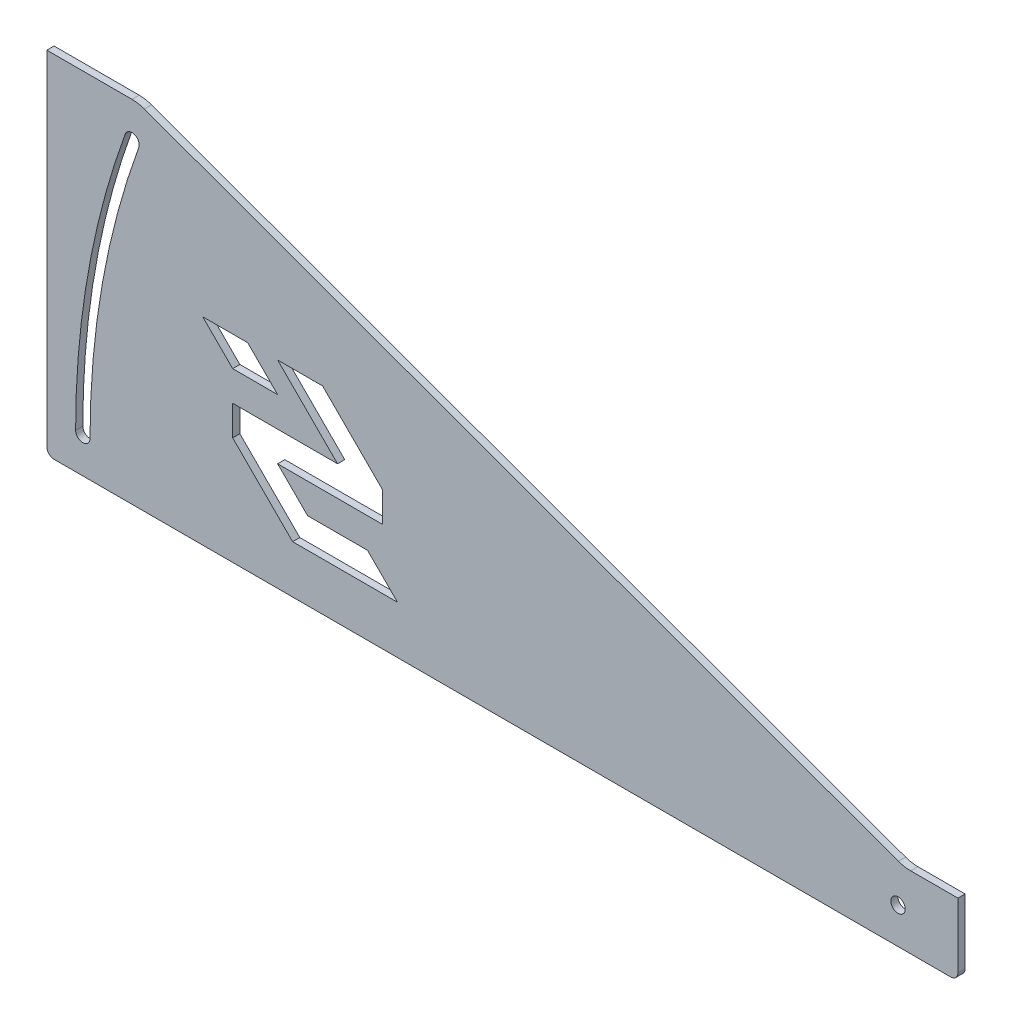
ISO-10303-21;
HEADER;
FILE_DESCRIPTION(('STEP AP214'),'2;1');
FILE_NAME('part.step','',(''),(''),'','','');
FILE_SCHEMA(('AUTOMOTIVE_DESIGN { 1 0 10303 214 1 1 1 1 }'));
ENDSEC;
DATA;
#1=APPLICATION_CONTEXT('core data for automotive mechanical design processes');
#2=APPLICATION_PROTOCOL_DEFINITION('international standard','automotive_design',2000,#1);
#3=PRODUCT_CONTEXT('',#1,'mechanical');
#4=PRODUCT('Part','Part','',(#3));
#5=PRODUCT_RELATED_PRODUCT_CATEGORY('part','',(#4));
#6=PRODUCT_DEFINITION_FORMATION('','',#4);
#7=PRODUCT_DEFINITION_CONTEXT('part definition',#1,'design');
#8=PRODUCT_DEFINITION('design','',#6,#7);
#9=PRODUCT_DEFINITION_SHAPE('','',#8);
#10=(LENGTH_UNIT() NAMED_UNIT(*) SI_UNIT(.MILLI.,.METRE.));
#11=(NAMED_UNIT(*) PLANE_ANGLE_UNIT() SI_UNIT($,.RADIAN.));
#12=(NAMED_UNIT(*) SI_UNIT($,.STERADIAN.) SOLID_ANGLE_UNIT());
#13=UNCERTAINTY_MEASURE_WITH_UNIT(LENGTH_MEASURE(1.E-05),#10,'distance_accuracy_value','');
#14=(GEOMETRIC_REPRESENTATION_CONTEXT(3) GLOBAL_UNCERTAINTY_ASSIGNED_CONTEXT((#13)) GLOBAL_UNIT_ASSIGNED_CONTEXT((#10,
#11,#12)) REPRESENTATION_CONTEXT('',''));
#15=CARTESIAN_POINT('',(0.,0.,0.));
#16=DIRECTION('',(0.,0.,1.));
#17=DIRECTION('',(1.,0.,0.));
#18=AXIS2_PLACEMENT_3D('',#15,#16,#17);
#19=CARTESIAN_POINT('',(0.,0.,3.));
#20=DIRECTION('',(0.,0.,1.));
#21=DIRECTION('',(1.,0.,0.));
#22=AXIS2_PLACEMENT_3D('',#19,#20,#21);
#23=PLANE('',#22);
#24=DIRECTION('',(-1.,0.,0.));
#25=VECTOR('',#24,1.);
#26=CARTESIAN_POINT('',(0.,-3.14342436536373,3.));
#27=LINE('',#26,#25);
#28=CARTESIAN_POINT('',(-88.75,-3.14342436536373,3.));
#29=VERTEX_POINT('',#28);
#30=CARTESIAN_POINT('',(-107.5,-3.14342436536372,3.));
#31=VERTEX_POINT('',#30);
#32=EDGE_CURVE('E395',#29,#31,#27,.T.);
#33=ORIENTED_EDGE('',*,*,#32,.T.);
#34=DIRECTION('',(-0.707106781186541,0.707106781186554,0.));
#35=VECTOR('',#34,1.);
#36=CARTESIAN_POINT('',(-55.3217121826829,-55.3217121826819,3.));
#37=LINE('',#36,#35);
#38=CARTESIAN_POINT('',(-120.,9.35657563463628,3.));
#39=VERTEX_POINT('',#38);
#40=EDGE_CURVE('E417',#31,#39,#37,.T.);
#41=ORIENTED_EDGE('',*,*,#40,.T.);
#42=DIRECTION('',(-1.,0.,0.));
#43=VECTOR('',#42,1.);
#44=CARTESIAN_POINT('',(0.,9.35657563463628,3.));
#45=LINE('',#44,#43);
#46=CARTESIAN_POINT('',(-101.25,9.35657563463628,3.));
#47=VERTEX_POINT('',#46);
#48=EDGE_CURVE('E293',#47,#39,#45,.T.);
#49=ORIENTED_EDGE('',*,*,#48,.F.);
#50=DIRECTION('',(-0.707106781186546,0.707106781186549,0.));
#51=VECTOR('',#50,1.);
#52=CARTESIAN_POINT('',(-45.946712182682,-45.9467121826818,3.));
#53=LINE('',#52,#51);
#54=EDGE_CURVE('E392',#29,#47,#53,.T.);
#55=ORIENTED_EDGE('',*,*,#54,.F.);
#56=EDGE_LOOP('',(#33,#41,#49,#55));
#57=FACE_BOUND('',#56,.T.);
#58=DIRECTION('',(1.,0.,0.));
#59=VECTOR('',#58,1.);
#60=CARTESIAN_POINT('',(0.,-73.1434243653637,3.));
#61=LINE('',#60,#59);
#62=CARTESIAN_POINT('',(-182.,-73.1434243653637,3.));
#63=VERTEX_POINT('',#62);
#64=CARTESIAN_POINT('',(192.,-73.1434243653636,3.));
#65=VERTEX_POINT('',#64);
#66=EDGE_CURVE('E430',#63,#65,#61,.T.);
#67=ORIENTED_EDGE('',*,*,#66,.T.);
#68=CARTESIAN_POINT('',(192.,-70.1434243653636,3.));
#69=DIRECTION('',(0.,0.,1.));
#70=DIRECTION('',(1.,0.,0.));
#71=AXIS2_PLACEMENT_3D('',#68,#69,#70);
#72=CIRCLE('',#71,3.);
#73=CARTESIAN_POINT('',(195.,-70.1434243653636,3.));
#74=VERTEX_POINT('',#73);
#75=EDGE_CURVE('E97',#65,#74,#72,.T.);
#76=ORIENTED_EDGE('',*,*,#75,.T.);
#77=DIRECTION('',(0.,-1.,0.));
#78=VECTOR('',#77,1.);
#79=CARTESIAN_POINT('',(195.,0.,3.));
#80=LINE('',#79,#78);
#81=CARTESIAN_POINT('',(195.,-43.1434243653637,3.));
#82=VERTEX_POINT('',#81);
#83=EDGE_CURVE('E434',#82,#74,#80,.T.);
#84=ORIENTED_EDGE('',*,*,#83,.F.);
#85=DIRECTION('',(1.,0.,0.));
#86=VECTOR('',#85,1.);
#87=CARTESIAN_POINT('',(0.,-43.1434243653635,3.));
#88=LINE('',#87,#86);
#89=CARTESIAN_POINT('',(175.289809421254,-43.1434243653637,3.));
#90=VERTEX_POINT('',#89);
#91=EDGE_CURVE('E439',#90,#82,#88,.T.);
#92=ORIENTED_EDGE('',*,*,#91,.F.);
#93=CARTESIAN_POINT('',(175.289809421254,-28.1434243653637,3.));
#94=DIRECTION('',(0.,0.,1.));
#95=DIRECTION('',(1.,0.,0.));
#96=AXIS2_PLACEMENT_3D('',#93,#94,#95);
#97=CIRCLE('',#96,15.);
#98=CARTESIAN_POINT('',(170.159507271369,-42.2388136771523,3.));
#99=VERTEX_POINT('',#98);
#100=EDGE_CURVE('E556',#90,#99,#97,.F.);
#101=ORIENTED_EDGE('',*,*,#100,.T.);
#102=DIRECTION('',(-0.939692620785908,0.342020143325669,0.));
#103=VECTOR('',#102,1.);
#104=CARTESIAN_POINT('',(6.32958810137079,17.3904003829649,3.));
#105=LINE('',#104,#103);
#106=CARTESIAN_POINT('',(-144.365188917324,72.2388136771523,3.));
#107=VERTEX_POINT('',#106);
#108=EDGE_CURVE('E442',#99,#107,#105,.T.);
#109=ORIENTED_EDGE('',*,*,#108,.T.);
#110=CARTESIAN_POINT('',(-149.495491067209,58.1434243653637,3.));
#111=DIRECTION('',(0.,0.,1.));
#112=DIRECTION('',(1.,0.,0.));
#113=AXIS2_PLACEMENT_3D('',#110,#111,#112);
#114=CIRCLE('',#113,15.);
#115=CARTESIAN_POINT('',(-149.495491067209,73.1434243653637,3.));
#116=VERTEX_POINT('',#115);
#117=EDGE_CURVE('E550',#107,#116,#114,.T.);
#118=ORIENTED_EDGE('',*,*,#117,.T.);
#119=DIRECTION('',(1.,0.,0.));
#120=VECTOR('',#119,1.);
#121=CARTESIAN_POINT('',(0.,73.1434243653637,3.));
#122=LINE('',#121,#120);
#123=CARTESIAN_POINT('',(-185.,73.1434243653637,3.));
#124=VERTEX_POINT('',#123);
#125=EDGE_CURVE('E446',#124,#116,#122,.T.);
#126=ORIENTED_EDGE('',*,*,#125,.F.);
#127=DIRECTION('',(0.,-1.,0.));
#128=VECTOR('',#127,1.);
#129=CARTESIAN_POINT('',(-185.,0.,3.));
#130=LINE('',#129,#128);
#131=CARTESIAN_POINT('',(-185.,-70.1434243653637,3.));
#132=VERTEX_POINT('',#131);
#133=EDGE_CURVE('E450',#124,#132,#130,.T.);
#134=ORIENTED_EDGE('',*,*,#133,.T.);
#135=CARTESIAN_POINT('',(-182.,-70.1434243653637,3.));
#136=DIRECTION('',(0.,0.,1.));
#137=DIRECTION('',(1.,0.,0.));
#138=AXIS2_PLACEMENT_3D('',#135,#136,#137);
#139=CIRCLE('',#138,3.);
#140=EDGE_CURVE('E576',#132,#63,#139,.T.);
#141=ORIENTED_EDGE('',*,*,#140,.T.);
#142=EDGE_LOOP('',(#67,#76,#84,#92,#101,#109,#118,#126,#134,#141));
#143=FACE_BOUND('',#142,.T.);
#144=CARTESIAN_POINT('',(170.,-58.1434243653637,3.));
#145=DIRECTION('',(0.,0.,1.));
#146=DIRECTION('',(1.,0.,0.));
#147=AXIS2_PLACEMENT_3D('',#144,#145,#146);
#148=CIRCLE('',#147,3.00000000000002);
#149=CARTESIAN_POINT('',(173.,-58.1434243653637,3.));
#150=VERTEX_POINT('',#149);
#151=EDGE_CURVE('E454',#150,#150,#148,.T.);
#152=ORIENTED_EDGE('',*,*,#151,.F.);
#153=EDGE_LOOP('',(#152));
#154=FACE_BOUND('',#153,.T.);
#155=CARTESIAN_POINT('',(-170.,-58.1434243653638,3.));
#156=DIRECTION('',(0.,0.,1.));
#157=DIRECTION('',(1.,0.,0.));
#158=AXIS2_PLACEMENT_3D('',#155,#156,#157);
#159=CIRCLE('',#158,2.99999999999999);
#160=CARTESIAN_POINT('',(-173.,-58.1434243653638,3.));
#161=VERTEX_POINT('',#160);
#162=CARTESIAN_POINT('',(-167.,-58.1434243653638,3.));
#163=VERTEX_POINT('',#162);
#164=EDGE_CURVE('E458',#161,#163,#159,.T.);
#165=ORIENTED_EDGE('',*,*,#164,.F.);
#166=CARTESIAN_POINT('',(170.,-58.1434243653637,3.));
#167=DIRECTION('',(0.,0.,1.));
#168=DIRECTION('',(1.,0.,0.));
#169=AXIS2_PLACEMENT_3D('',#166,#167,#168);
#170=CIRCLE('',#169,343.);
#171=CARTESIAN_POINT('',(-152.314568929567,59.1694847953408,3.));
#172=VERTEX_POINT('',#171);
#173=EDGE_CURVE('E462',#172,#161,#170,.T.);
#174=ORIENTED_EDGE('',*,*,#173,.F.);
#175=CARTESIAN_POINT('',(-149.495491067209,58.1434243653638,3.));
#176=DIRECTION('',(0.,0.,1.));
#177=DIRECTION('',(1.,0.,0.));
#178=AXIS2_PLACEMENT_3D('',#175,#176,#177);
#179=CIRCLE('',#178,2.99999999999997);
#180=CARTESIAN_POINT('',(-146.676413204851,57.1173639353868,3.));
#181=VERTEX_POINT('',#180);
#182=EDGE_CURVE('E466',#181,#172,#179,.T.);
#183=ORIENTED_EDGE('',*,*,#182,.F.);
#184=CARTESIAN_POINT('',(170.,-58.1434243653637,3.));
#185=DIRECTION('',(0.,0.,1.));
#186=DIRECTION('',(1.,0.,0.));
#187=AXIS2_PLACEMENT_3D('',#184,#185,#186);
#188=CIRCLE('',#187,337.);
#189=EDGE_CURVE('E470',#181,#163,#188,.T.);
#190=ORIENTED_EDGE('',*,*,#189,.T.);
#191=EDGE_LOOP('',(#165,#174,#183,#190));
#192=FACE_BOUND('',#191,.T.);
#193=DIRECTION('',(-1.,0.,0.));
#194=VECTOR('',#193,1.);
#195=CARTESIAN_POINT('',(0.,9.35657563463628,3.));
#196=LINE('',#195,#194);
#197=CARTESIAN_POINT('',(-70.,9.35657563463628,3.));
#198=VERTEX_POINT('',#197);
#199=CARTESIAN_POINT('',(-88.7500000000001,9.35657563463628,3.));
#200=VERTEX_POINT('',#199);
#201=EDGE_CURVE('E307',#198,#200,#196,.T.);
#202=ORIENTED_EDGE('',*,*,#201,.F.);
#203=DIRECTION('',(-0.707106781186546,0.707106781186549,0.));
#204=VECTOR('',#203,1.);
#205=CARTESIAN_POINT('',(-30.321712182682,-30.3217121826819,3.));
#206=LINE('',#205,#204);
#207=CARTESIAN_POINT('',(-45.0000000000001,-15.6434243653637,3.));
#208=VERTEX_POINT('',#207);
#209=EDGE_CURVE('E298',#208,#198,#206,.T.);
#210=ORIENTED_EDGE('',*,*,#209,.F.);
#211=DIRECTION('',(0.,-1.,0.));
#212=VECTOR('',#211,1.);
#213=CARTESIAN_POINT('',(-45.0000000000001,0.,3.));
#214=LINE('',#213,#212);
#215=CARTESIAN_POINT('',(-45.0000000000001,-28.1434243653637,3.));
#216=VERTEX_POINT('',#215);
#217=EDGE_CURVE('E284',#208,#216,#214,.T.);
#218=ORIENTED_EDGE('',*,*,#217,.T.);
#219=DIRECTION('',(-1.,0.,0.));
#220=VECTOR('',#219,1.);
#221=CARTESIAN_POINT('',(0.,-28.1434243653637,3.));
#222=LINE('',#221,#220);
#223=CARTESIAN_POINT('',(-88.7500000000002,-28.1434243653637,3.));
#224=VERTEX_POINT('',#223);
#225=EDGE_CURVE('E1036',#216,#224,#222,.T.);
#226=ORIENTED_EDGE('',*,*,#225,.T.);
#227=DIRECTION('',(-0.707106781186546,0.707106781186549,0.));
#228=VECTOR('',#227,1.);
#229=CARTESIAN_POINT('',(-58.4467121826821,-58.4467121826819,3.));
#230=LINE('',#229,#228);
#231=CARTESIAN_POINT('',(-76.2500000000002,-40.6434243653637,3.));
#232=VERTEX_POINT('',#231);
#233=EDGE_CURVE('E1043',#232,#224,#230,.T.);
#234=ORIENTED_EDGE('',*,*,#233,.F.);
#235=DIRECTION('',(-1.,0.,0.));
#236=VECTOR('',#235,1.);
#237=CARTESIAN_POINT('',(0.,-40.6434243653637,3.));
#238=LINE('',#237,#236);
#239=CARTESIAN_POINT('',(-51.2500000000001,-40.6434243653637,3.));
#240=VERTEX_POINT('',#239);
#241=EDGE_CURVE('E1048',#240,#232,#238,.T.);
#242=ORIENTED_EDGE('',*,*,#241,.F.);
#243=DIRECTION('',(0.707106781186546,-0.707106781186549,0.));
#244=VECTOR('',#243,1.);
#245=CARTESIAN_POINT('',(-45.946712182682,-45.9467121826818,3.));
#246=LINE('',#245,#244);
#247=CARTESIAN_POINT('',(-38.7500000000002,-53.1434243653637,3.));
#248=VERTEX_POINT('',#247);
#249=EDGE_CURVE('E1053',#240,#248,#246,.T.);
#250=ORIENTED_EDGE('',*,*,#249,.T.);
#251=DIRECTION('',(-1.,0.,0.));
#252=VECTOR('',#251,1.);
#253=CARTESIAN_POINT('',(0.,-53.1434243653637,3.));
#254=LINE('',#253,#252);
#255=CARTESIAN_POINT('',(-82.5000000000003,-53.1434243653637,3.));
#256=VERTEX_POINT('',#255);
#257=EDGE_CURVE('E1057',#248,#256,#254,.T.);
#258=ORIENTED_EDGE('',*,*,#257,.T.);
#259=DIRECTION('',(-0.707106781186546,0.707106781186549,0.));
#260=VECTOR('',#259,1.);
#261=CARTESIAN_POINT('',(-67.8217121826821,-67.8217121826819,3.));
#262=LINE('',#261,#260);
#263=CARTESIAN_POINT('',(-107.5,-28.1434243653637,3.));
#264=VERTEX_POINT('',#263);
#265=EDGE_CURVE('E1061',#256,#264,#262,.T.);
#266=ORIENTED_EDGE('',*,*,#265,.T.);
#267=DIRECTION('',(0.,1.,0.));
#268=VECTOR('',#267,1.);
#269=CARTESIAN_POINT('',(-107.5,1.19348975147204E-13,3.));
#270=LINE('',#269,#268);
#271=CARTESIAN_POINT('',(-107.5,-15.6434243653637,3.));
#272=VERTEX_POINT('',#271);
#273=EDGE_CURVE('E1065',#264,#272,#270,.T.);
#274=ORIENTED_EDGE('',*,*,#273,.T.);
#275=DIRECTION('',(-1.,0.,0.));
#276=VECTOR('',#275,1.);
#277=CARTESIAN_POINT('',(0.,-15.6434243653637,3.));
#278=LINE('',#277,#276);
#279=CARTESIAN_POINT('',(-63.7500000000001,-15.6434243653637,3.));
#280=VERTEX_POINT('',#279);
#281=EDGE_CURVE('E1069',#280,#272,#278,.T.);
#282=ORIENTED_EDGE('',*,*,#281,.F.);
#283=DIRECTION('',(-0.707106781186546,0.707106781186549,0.));
#284=VECTOR('',#283,1.);
#285=CARTESIAN_POINT('',(-39.696712182682,-39.6967121826819,3.));
#286=LINE('',#285,#284);
#287=EDGE_CURVE('E314',#280,#200,#286,.T.);
#288=ORIENTED_EDGE('',*,*,#287,.T.);
#289=EDGE_LOOP('',(#202,#210,#218,#226,#234,#242,#250,#258,#266,#274,#282,#288));
#290=FACE_BOUND('',#289,.T.);
#291=ADVANCED_FACE('F88',(#57,#143,#154,#192,#290),#23,.T.);
#292=CARTESIAN_POINT('',(0.,0.,0.));
#293=DIRECTION('',(0.,0.,1.));
#294=DIRECTION('',(1.,0.,0.));
#295=AXIS2_PLACEMENT_3D('',#292,#293,#294);
#296=PLANE('',#295);
#297=CARTESIAN_POINT('',(-170.,-58.1434243653638,0.));
#298=DIRECTION('',(0.,0.,1.));
#299=DIRECTION('',(1.,0.,0.));
#300=AXIS2_PLACEMENT_3D('',#297,#298,#299);
#301=CIRCLE('',#300,2.99999999999999);
#302=CARTESIAN_POINT('',(-173.,-58.1434243653638,0.));
#303=VERTEX_POINT('',#302);
#304=CARTESIAN_POINT('',(-167.,-58.1434243653638,0.));
#305=VERTEX_POINT('',#304);
#306=EDGE_CURVE('E500',#303,#305,#301,.T.);
#307=ORIENTED_EDGE('',*,*,#306,.T.);
#308=CARTESIAN_POINT('',(170.,-58.1434243653637,0.));
#309=DIRECTION('',(0.,0.,1.));
#310=DIRECTION('',(1.,0.,0.));
#311=AXIS2_PLACEMENT_3D('',#308,#309,#310);
#312=CIRCLE('',#311,337.);
#313=CARTESIAN_POINT('',(-146.676413204851,57.1173639353868,0.));
#314=VERTEX_POINT('',#313);
#315=EDGE_CURVE('E435',#314,#305,#312,.T.);
#316=ORIENTED_EDGE('',*,*,#315,.F.);
#317=CARTESIAN_POINT('',(-149.495491067209,58.1434243653638,0.));
#318=DIRECTION('',(0.,0.,1.));
#319=DIRECTION('',(1.,0.,0.));
#320=AXIS2_PLACEMENT_3D('',#317,#318,#319);
#321=CIRCLE('',#320,2.99999999999997);
#322=CARTESIAN_POINT('',(-152.314568929567,59.1694847953408,0.));
#323=VERTEX_POINT('',#322);
#324=EDGE_CURVE('E508',#314,#323,#321,.T.);
#325=ORIENTED_EDGE('',*,*,#324,.T.);
#326=CARTESIAN_POINT('',(170.,-58.1434243653637,0.));
#327=DIRECTION('',(0.,0.,1.));
#328=DIRECTION('',(1.,0.,0.));
#329=AXIS2_PLACEMENT_3D('',#326,#327,#328);
#330=CIRCLE('',#329,343.);
#331=EDGE_CURVE('E504',#323,#303,#330,.T.);
#332=ORIENTED_EDGE('',*,*,#331,.T.);
#333=EDGE_LOOP('',(#307,#316,#325,#332));
#334=FACE_BOUND('',#333,.T.);
#335=CARTESIAN_POINT('',(170.,-58.1434243653637,0.));
#336=DIRECTION('',(0.,0.,1.));
#337=DIRECTION('',(1.,0.,0.));
#338=AXIS2_PLACEMENT_3D('',#335,#336,#337);
#339=CIRCLE('',#338,3.00000000000002);
#340=CARTESIAN_POINT('',(173.,-58.1434243653637,0.));
#341=VERTEX_POINT('',#340);
#342=EDGE_CURVE('E496',#341,#341,#339,.T.);
#343=ORIENTED_EDGE('',*,*,#342,.T.);
#344=EDGE_LOOP('',(#343));
#345=FACE_BOUND('',#344,.T.);
#346=DIRECTION('',(0.,-1.,0.));
#347=VECTOR('',#346,1.);
#348=CARTESIAN_POINT('',(195.,0.,0.));
#349=LINE('',#348,#347);
#350=CARTESIAN_POINT('',(195.,-43.1434243653637,0.));
#351=VERTEX_POINT('',#350);
#352=CARTESIAN_POINT('',(195.,-70.1434243653636,0.));
#353=VERTEX_POINT('',#352);
#354=EDGE_CURVE('E477',#351,#353,#349,.T.);
#355=ORIENTED_EDGE('',*,*,#354,.T.);
#356=CARTESIAN_POINT('',(192.,-70.1434243653636,0.));
#357=DIRECTION('',(0.,0.,1.));
#358=DIRECTION('',(1.,0.,0.));
#359=AXIS2_PLACEMENT_3D('',#356,#357,#358);
#360=CIRCLE('',#359,3.);
#361=CARTESIAN_POINT('',(192.,-73.1434243653636,0.));
#362=VERTEX_POINT('',#361);
#363=EDGE_CURVE('E566',#353,#362,#360,.F.);
#364=ORIENTED_EDGE('',*,*,#363,.T.);
#365=DIRECTION('',(1.,0.,0.));
#366=VECTOR('',#365,1.);
#367=CARTESIAN_POINT('',(0.,-73.1434243653637,0.));
#368=LINE('',#367,#366);
#369=CARTESIAN_POINT('',(-182.,-73.1434243653637,0.));
#370=VERTEX_POINT('',#369);
#371=EDGE_CURVE('E429',#370,#362,#368,.T.);
#372=ORIENTED_EDGE('',*,*,#371,.F.);
#373=CARTESIAN_POINT('',(-182.,-70.1434243653637,0.));
#374=DIRECTION('',(0.,0.,1.));
#375=DIRECTION('',(1.,0.,0.));
#376=AXIS2_PLACEMENT_3D('',#373,#374,#375);
#377=CIRCLE('',#376,3.);
#378=CARTESIAN_POINT('',(-185.,-70.1434243653637,0.));
#379=VERTEX_POINT('',#378);
#380=EDGE_CURVE('E563',#370,#379,#377,.F.);
#381=ORIENTED_EDGE('',*,*,#380,.T.);
#382=DIRECTION('',(0.,-1.,0.));
#383=VECTOR('',#382,1.);
#384=CARTESIAN_POINT('',(-185.,0.,0.));
#385=LINE('',#384,#383);
#386=CARTESIAN_POINT('',(-185.,73.1434243653637,0.));
#387=VERTEX_POINT('',#386);
#388=EDGE_CURVE('E492',#387,#379,#385,.T.);
#389=ORIENTED_EDGE('',*,*,#388,.F.);
#390=DIRECTION('',(1.,0.,0.));
#391=VECTOR('',#390,1.);
#392=CARTESIAN_POINT('',(0.,73.1434243653637,0.));
#393=LINE('',#392,#391);
#394=CARTESIAN_POINT('',(-149.495491067209,73.1434243653637,0.));
#395=VERTEX_POINT('',#394);
#396=EDGE_CURVE('E488',#387,#395,#393,.T.);
#397=ORIENTED_EDGE('',*,*,#396,.T.);
#398=CARTESIAN_POINT('',(-149.495491067209,58.1434243653637,0.));
#399=DIRECTION('',(0.,0.,1.));
#400=DIRECTION('',(1.,0.,0.));
#401=AXIS2_PLACEMENT_3D('',#398,#399,#400);
#402=CIRCLE('',#401,15.);
#403=CARTESIAN_POINT('',(-144.365188917324,72.2388136771523,0.));
#404=VERTEX_POINT('',#403);
#405=EDGE_CURVE('E547',#395,#404,#402,.F.);
#406=ORIENTED_EDGE('',*,*,#405,.T.);
#407=DIRECTION('',(-0.939692620785908,0.342020143325669,0.));
#408=VECTOR('',#407,1.);
#409=CARTESIAN_POINT('',(6.32958810137079,17.3904003829649,0.));
#410=LINE('',#409,#408);
#411=CARTESIAN_POINT('',(170.159507271369,-42.2388136771523,0.));
#412=VERTEX_POINT('',#411);
#413=EDGE_CURVE('E484',#412,#404,#410,.T.);
#414=ORIENTED_EDGE('',*,*,#413,.F.);
#415=CARTESIAN_POINT('',(175.289809421254,-28.1434243653637,0.));
#416=DIRECTION('',(0.,0.,1.));
#417=DIRECTION('',(1.,0.,0.));
#418=AXIS2_PLACEMENT_3D('',#415,#416,#417);
#419=CIRCLE('',#418,15.);
#420=CARTESIAN_POINT('',(175.289809421254,-43.1434243653637,0.));
#421=VERTEX_POINT('',#420);
#422=EDGE_CURVE('E553',#412,#421,#419,.T.);
#423=ORIENTED_EDGE('',*,*,#422,.T.);
#424=DIRECTION('',(1.,0.,0.));
#425=VECTOR('',#424,1.);
#426=CARTESIAN_POINT('',(0.,-43.1434243653635,0.));
#427=LINE('',#426,#425);
#428=EDGE_CURVE('E481',#421,#351,#427,.T.);
#429=ORIENTED_EDGE('',*,*,#428,.T.);
#430=EDGE_LOOP('',(#355,#364,#372,#381,#389,#397,#406,#414,#423,#429));
#431=FACE_BOUND('',#430,.T.);
#432=DIRECTION('',(-0.707106781186541,0.707106781186554,0.));
#433=VECTOR('',#432,1.);
#434=CARTESIAN_POINT('',(-55.3217121826829,-55.3217121826819,0.));
#435=LINE('',#434,#433);
#436=CARTESIAN_POINT('',(-107.5,-3.14342436536371,0.));
#437=VERTEX_POINT('',#436);
#438=CARTESIAN_POINT('',(-120.,9.35657563463628,0.));
#439=VERTEX_POINT('',#438);
#440=EDGE_CURVE('E402',#437,#439,#435,.T.);
#441=ORIENTED_EDGE('',*,*,#440,.F.);
#442=DIRECTION('',(-1.,0.,0.));
#443=VECTOR('',#442,1.);
#444=CARTESIAN_POINT('',(0.,-3.14342436536373,0.));
#445=LINE('',#444,#443);
#446=CARTESIAN_POINT('',(-88.75,-3.14342436536373,0.));
#447=VERTEX_POINT('',#446);
#448=EDGE_CURVE('E399',#447,#437,#445,.T.);
#449=ORIENTED_EDGE('',*,*,#448,.F.);
#450=DIRECTION('',(-0.707106781186546,0.707106781186549,0.));
#451=VECTOR('',#450,1.);
#452=CARTESIAN_POINT('',(-45.946712182682,-45.9467121826818,0.));
#453=LINE('',#452,#451);
#454=CARTESIAN_POINT('',(-101.25,9.35657563463628,0.));
#455=VERTEX_POINT('',#454);
#456=EDGE_CURVE('E409',#447,#455,#453,.T.);
#457=ORIENTED_EDGE('',*,*,#456,.T.);
#458=DIRECTION('',(-1.,0.,0.));
#459=VECTOR('',#458,1.);
#460=CARTESIAN_POINT('',(0.,9.35657563463628,0.));
#461=LINE('',#460,#459);
#462=EDGE_CURVE('E405',#455,#439,#461,.T.);
#463=ORIENTED_EDGE('',*,*,#462,.T.);
#464=EDGE_LOOP('',(#441,#449,#457,#463));
#465=FACE_BOUND('',#464,.T.);
#466=DIRECTION('',(-0.707106781186546,0.707106781186549,0.));
#467=VECTOR('',#466,1.);
#468=CARTESIAN_POINT('',(-30.321712182682,-30.3217121826819,0.));
#469=LINE('',#468,#467);
#470=CARTESIAN_POINT('',(-45.0000000000001,-15.6434243653637,0.));
#471=VERTEX_POINT('',#470);
#472=CARTESIAN_POINT('',(-70.,9.35657563463626,0.));
#473=VERTEX_POINT('',#472);
#474=EDGE_CURVE('E301',#471,#473,#469,.T.);
#475=ORIENTED_EDGE('',*,*,#474,.T.);
#476=DIRECTION('',(-1.,0.,0.));
#477=VECTOR('',#476,1.);
#478=CARTESIAN_POINT('',(0.,9.35657563463628,0.));
#479=LINE('',#478,#477);
#480=CARTESIAN_POINT('',(-88.7500000000001,9.35657563463628,0.));
#481=VERTEX_POINT('',#480);
#482=EDGE_CURVE('E303',#473,#481,#479,.T.);
#483=ORIENTED_EDGE('',*,*,#482,.T.);
#484=DIRECTION('',(-0.707106781186546,0.707106781186549,0.));
#485=VECTOR('',#484,1.);
#486=CARTESIAN_POINT('',(-39.696712182682,-39.6967121826819,0.));
#487=LINE('',#486,#485);
#488=CARTESIAN_POINT('',(-63.7500000000001,-15.6434243653637,0.));
#489=VERTEX_POINT('',#488);
#490=EDGE_CURVE('E352',#489,#481,#487,.T.);
#491=ORIENTED_EDGE('',*,*,#490,.F.);
#492=DIRECTION('',(-1.,0.,0.));
#493=VECTOR('',#492,1.);
#494=CARTESIAN_POINT('',(0.,-15.6434243653637,0.));
#495=LINE('',#494,#493);
#496=CARTESIAN_POINT('',(-107.5,-15.6434243653637,0.));
#497=VERTEX_POINT('',#496);
#498=EDGE_CURVE('E348',#489,#497,#495,.T.);
#499=ORIENTED_EDGE('',*,*,#498,.T.);
#500=DIRECTION('',(0.,1.,0.));
#501=VECTOR('',#500,1.);
#502=CARTESIAN_POINT('',(-107.5,1.19348975147204E-13,0.));
#503=LINE('',#502,#501);
#504=CARTESIAN_POINT('',(-107.5,-28.1434243653637,0.));
#505=VERTEX_POINT('',#504);
#506=EDGE_CURVE('E344',#505,#497,#503,.T.);
#507=ORIENTED_EDGE('',*,*,#506,.F.);
#508=DIRECTION('',(-0.707106781186546,0.707106781186549,0.));
#509=VECTOR('',#508,1.);
#510=CARTESIAN_POINT('',(-67.8217121826821,-67.8217121826819,0.));
#511=LINE('',#510,#509);
#512=CARTESIAN_POINT('',(-82.5000000000003,-53.1434243653637,0.));
#513=VERTEX_POINT('',#512);
#514=EDGE_CURVE('E340',#513,#505,#511,.T.);
#515=ORIENTED_EDGE('',*,*,#514,.F.);
#516=DIRECTION('',(-1.,0.,0.));
#517=VECTOR('',#516,1.);
#518=CARTESIAN_POINT('',(0.,-53.1434243653637,0.));
#519=LINE('',#518,#517);
#520=CARTESIAN_POINT('',(-38.7500000000002,-53.1434243653637,0.));
#521=VERTEX_POINT('',#520);
#522=EDGE_CURVE('E336',#521,#513,#519,.T.);
#523=ORIENTED_EDGE('',*,*,#522,.F.);
#524=DIRECTION('',(0.707106781186546,-0.707106781186549,0.));
#525=VECTOR('',#524,1.);
#526=CARTESIAN_POINT('',(-45.946712182682,-45.9467121826818,0.));
#527=LINE('',#526,#525);
#528=CARTESIAN_POINT('',(-51.2500000000001,-40.6434243653637,0.));
#529=VERTEX_POINT('',#528);
#530=EDGE_CURVE('E332',#529,#521,#527,.T.);
#531=ORIENTED_EDGE('',*,*,#530,.F.);
#532=DIRECTION('',(-1.,0.,0.));
#533=VECTOR('',#532,1.);
#534=CARTESIAN_POINT('',(0.,-40.6434243653637,0.));
#535=LINE('',#534,#533);
#536=CARTESIAN_POINT('',(-76.2500000000002,-40.6434243653637,0.));
#537=VERTEX_POINT('',#536);
#538=EDGE_CURVE('E328',#529,#537,#535,.T.);
#539=ORIENTED_EDGE('',*,*,#538,.T.);
#540=DIRECTION('',(-0.707106781186546,0.707106781186549,0.));
#541=VECTOR('',#540,1.);
#542=CARTESIAN_POINT('',(-58.4467121826821,-58.4467121826819,0.));
#543=LINE('',#542,#541);
#544=CARTESIAN_POINT('',(-88.7500000000002,-28.1434243653637,0.));
#545=VERTEX_POINT('',#544);
#546=EDGE_CURVE('E324',#537,#545,#543,.T.);
#547=ORIENTED_EDGE('',*,*,#546,.T.);
#548=DIRECTION('',(-1.,0.,0.));
#549=VECTOR('',#548,1.);
#550=CARTESIAN_POINT('',(0.,-28.1434243653637,0.));
#551=LINE('',#550,#549);
#552=CARTESIAN_POINT('',(-45.0000000000001,-28.1434243653637,0.));
#553=VERTEX_POINT('',#552);
#554=EDGE_CURVE('E320',#553,#545,#551,.T.);
#555=ORIENTED_EDGE('',*,*,#554,.F.);
#556=DIRECTION('',(0.,-1.,0.));
#557=VECTOR('',#556,1.);
#558=CARTESIAN_POINT('',(-45.0000000000001,0.,0.));
#559=LINE('',#558,#557);
#560=EDGE_CURVE('E312',#471,#553,#559,.T.);
#561=ORIENTED_EDGE('',*,*,#560,.F.);
#562=EDGE_LOOP('',(#475,#483,#491,#499,#507,#515,#523,#531,#539,#547,#555,#561));
#563=FACE_BOUND('',#562,.T.);
#564=ADVANCED_FACE('F595',(#334,#345,#431,#465,#563),#296,.F.);
#565=CARTESIAN_POINT('',(-170.,-58.1434243653638,3.));
#566=DIRECTION('',(0.,0.,-1.));
#567=DIRECTION('',(-1.,0.,0.));
#568=AXIS2_PLACEMENT_3D('',#565,#566,#567);
#569=CYLINDRICAL_SURFACE('',#568,2.99999999999999);
#570=ORIENTED_EDGE('',*,*,#306,.F.);
#571=DIRECTION('',(0.,0.,-1.));
#572=VECTOR('',#571,1.);
#573=CARTESIAN_POINT('',(-173.,-58.1434243653638,3.));
#574=LINE('',#573,#572);
#575=EDGE_CURVE('E525',#161,#303,#574,.T.);
#576=ORIENTED_EDGE('',*,*,#575,.F.);
#577=ORIENTED_EDGE('',*,*,#164,.T.);
#578=DIRECTION('',(0.,0.,-1.));
#579=VECTOR('',#578,1.);
#580=CARTESIAN_POINT('',(-167.,-58.1434243653638,3.));
#581=LINE('',#580,#579);
#582=EDGE_CURVE('E515',#163,#305,#581,.T.);
#583=ORIENTED_EDGE('',*,*,#582,.T.);
#584=EDGE_LOOP('',(#570,#576,#577,#583));
#585=FACE_BOUND('',#584,.T.);
#586=ADVANCED_FACE('F642',(#585),#569,.F.);
#587=CARTESIAN_POINT('',(170.,-58.1434243653637,3.));
#588=DIRECTION('',(0.,0.,-1.));
#589=DIRECTION('',(-1.,0.,0.));
#590=AXIS2_PLACEMENT_3D('',#587,#588,#589);
#591=CYLINDRICAL_SURFACE('',#590,343.);
#592=ORIENTED_EDGE('',*,*,#331,.F.);
#593=DIRECTION('',(0.,0.,-1.));
#594=VECTOR('',#593,1.);
#595=CARTESIAN_POINT('',(-152.314568929567,59.1694847953408,3.));
#596=LINE('',#595,#594);
#597=EDGE_CURVE('E522',#172,#323,#596,.T.);
#598=ORIENTED_EDGE('',*,*,#597,.F.);
#599=ORIENTED_EDGE('',*,*,#173,.T.);
#600=ORIENTED_EDGE('',*,*,#575,.T.);
#601=EDGE_LOOP('',(#592,#598,#599,#600));
#602=FACE_BOUND('',#601,.T.);
#603=ADVANCED_FACE('F656',(#602),#591,.F.);
#604=CARTESIAN_POINT('',(-149.495491067209,58.1434243653638,3.));
#605=DIRECTION('',(0.,0.,-1.));
#606=DIRECTION('',(-1.,0.,0.));
#607=AXIS2_PLACEMENT_3D('',#604,#605,#606);
#608=CYLINDRICAL_SURFACE('',#607,2.99999999999997);
#609=ORIENTED_EDGE('',*,*,#324,.F.);
#610=DIRECTION('',(0.,0.,-1.));
#611=VECTOR('',#610,1.);
#612=CARTESIAN_POINT('',(-146.676413204851,57.1173639353868,3.));
#613=LINE('',#612,#611);
#614=EDGE_CURVE('E518',#181,#314,#613,.T.);
#615=ORIENTED_EDGE('',*,*,#614,.F.);
#616=ORIENTED_EDGE('',*,*,#182,.T.);
#617=ORIENTED_EDGE('',*,*,#597,.T.);
#618=EDGE_LOOP('',(#609,#615,#616,#617));
#619=FACE_BOUND('',#618,.T.);
#620=ADVANCED_FACE('F653',(#619),#608,.F.);
#621=CARTESIAN_POINT('',(0.,-73.1434243653637,3.));
#622=DIRECTION('',(0.,1.,0.));
#623=DIRECTION('',(-1.,0.,0.));
#624=AXIS2_PLACEMENT_3D('',#621,#622,#623);
#625=PLANE('',#624);
#626=ORIENTED_EDGE('',*,*,#371,.T.);
#627=DIRECTION('',(0.,0.,-1.));
#628=VECTOR('',#627,1.);
#629=CARTESIAN_POINT('',(192.,-73.1434243653636,3.));
#630=LINE('',#629,#628);
#631=EDGE_CURVE('E573',#362,#65,#630,.F.);
#632=ORIENTED_EDGE('',*,*,#631,.T.);
#633=ORIENTED_EDGE('',*,*,#66,.F.);
#634=DIRECTION('',(0.,0.,-1.));
#635=VECTOR('',#634,1.);
#636=CARTESIAN_POINT('',(-182.,-73.1434243653637,3.));
#637=LINE('',#636,#635);
#638=EDGE_CURVE('E569',#63,#370,#637,.T.);
#639=ORIENTED_EDGE('',*,*,#638,.T.);
#640=EDGE_LOOP('',(#626,#632,#633,#639));
#641=FACE_BOUND('',#640,.T.);
#642=ADVANCED_FACE('F598',(#641),#625,.F.);
#643=CARTESIAN_POINT('',(195.,0.,3.));
#644=DIRECTION('',(1.,0.,0.));
#645=DIRECTION('',(0.,0.,-1.));
#646=AXIS2_PLACEMENT_3D('',#643,#644,#645);
#647=PLANE('',#646);
#648=ORIENTED_EDGE('',*,*,#83,.T.);
#649=DIRECTION('',(0.,0.,-1.));
#650=VECTOR('',#649,1.);
#651=CARTESIAN_POINT('',(195.,-70.1434243653636,0.));
#652=LINE('',#651,#650);
#653=EDGE_CURVE('E559',#74,#353,#652,.T.);
#654=ORIENTED_EDGE('',*,*,#653,.T.);
#655=ORIENTED_EDGE('',*,*,#354,.F.);
#656=DIRECTION('',(0.,0.,-1.));
#657=VECTOR('',#656,1.);
#658=CARTESIAN_POINT('',(195.,-43.1434243653637,3.));
#659=LINE('',#658,#657);
#660=EDGE_CURVE('E519',#82,#351,#659,.T.);
#661=ORIENTED_EDGE('',*,*,#660,.F.);
#662=EDGE_LOOP('',(#648,#654,#655,#661));
#663=FACE_BOUND('',#662,.T.);
#664=ADVANCED_FACE('F590',(#663),#647,.T.);
#665=CARTESIAN_POINT('',(0.,-43.1434243653635,3.));
#666=DIRECTION('',(0.,1.,0.));
#667=DIRECTION('',(-1.,0.,0.));
#668=AXIS2_PLACEMENT_3D('',#665,#666,#667);
#669=PLANE('',#668);
#670=ORIENTED_EDGE('',*,*,#428,.F.);
#671=DIRECTION('',(0.,0.,-1.));
#672=VECTOR('',#671,1.);
#673=CARTESIAN_POINT('',(175.289809421254,-43.1434243653637,3.));
#674=LINE('',#673,#672);
#675=EDGE_CURVE('E540',#421,#90,#674,.F.);
#676=ORIENTED_EDGE('',*,*,#675,.T.);
#677=ORIENTED_EDGE('',*,*,#91,.T.);
#678=ORIENTED_EDGE('',*,*,#660,.T.);
#679=EDGE_LOOP('',(#670,#676,#677,#678));
#680=FACE_BOUND('',#679,.T.);
#681=ADVANCED_FACE('F627',(#680),#669,.T.);
#682=CARTESIAN_POINT('',(6.32958810137079,17.3904003829649,3.));
#683=DIRECTION('',(-0.342020143325669,-0.939692620785908,0.));
#684=DIRECTION('',(0.939692620785908,-0.342020143325669,0.));
#685=AXIS2_PLACEMENT_3D('',#682,#683,#684);
#686=PLANE('',#685);
#687=ORIENTED_EDGE('',*,*,#108,.F.);
#688=DIRECTION('',(0.,0.,-1.));
#689=VECTOR('',#688,1.);
#690=CARTESIAN_POINT('',(170.159507271369,-42.2388136771523,3.));
#691=LINE('',#690,#689);
#692=EDGE_CURVE('E536',#99,#412,#691,.T.);
#693=ORIENTED_EDGE('',*,*,#692,.T.);
#694=ORIENTED_EDGE('',*,*,#413,.T.);
#695=DIRECTION('',(0.,0.,-1.));
#696=VECTOR('',#695,1.);
#697=CARTESIAN_POINT('',(-144.365188917324,72.2388136771523,3.));
#698=LINE('',#697,#696);
#699=EDGE_CURVE('E528',#404,#107,#698,.F.);
#700=ORIENTED_EDGE('',*,*,#699,.T.);
#701=EDGE_LOOP('',(#687,#693,#694,#700));
#702=FACE_BOUND('',#701,.T.);
#703=ADVANCED_FACE('F617',(#702),#686,.F.);
#704=CARTESIAN_POINT('',(0.,73.1434243653637,3.));
#705=DIRECTION('',(0.,1.,0.));
#706=DIRECTION('',(0.,0.,1.));
#707=AXIS2_PLACEMENT_3D('',#704,#705,#706);
#708=PLANE('',#707);
#709=ORIENTED_EDGE('',*,*,#125,.T.);
#710=DIRECTION('',(0.,0.,-1.));
#711=VECTOR('',#710,1.);
#712=CARTESIAN_POINT('',(-149.495491067209,73.1434243653637,0.));
#713=LINE('',#712,#711);
#714=EDGE_CURVE('E543',#116,#395,#713,.T.);
#715=ORIENTED_EDGE('',*,*,#714,.T.);
#716=ORIENTED_EDGE('',*,*,#396,.F.);
#717=DIRECTION('',(0.,0.,-1.));
#718=VECTOR('',#717,1.);
#719=CARTESIAN_POINT('',(-185.,73.1434243653637,3.));
#720=LINE('',#719,#718);
#721=EDGE_CURVE('E473',#124,#387,#720,.T.);
#722=ORIENTED_EDGE('',*,*,#721,.F.);
#723=EDGE_LOOP('',(#709,#715,#716,#722));
#724=FACE_BOUND('',#723,.T.);
#725=ADVANCED_FACE('F610',(#724),#708,.T.);
#726=CARTESIAN_POINT('',(170.,-58.1434243653637,3.));
#727=DIRECTION('',(0.,0.,-1.));
#728=DIRECTION('',(-1.,0.,0.));
#729=AXIS2_PLACEMENT_3D('',#726,#727,#728);
#730=CYLINDRICAL_SURFACE('',#729,3.00000000000002);
#731=ORIENTED_EDGE('',*,*,#151,.T.);
#732=EDGE_LOOP('',(#731));
#733=FACE_BOUND('',#732,.T.);
#734=ORIENTED_EDGE('',*,*,#342,.F.);
#735=EDGE_LOOP('',(#734));
#736=FACE_BOUND('',#735,.T.);
#737=ADVANCED_FACE('F664',(#733,#736),#730,.F.);
#738=CARTESIAN_POINT('',(-185.,0.,3.));
#739=DIRECTION('',(1.,0.,0.));
#740=DIRECTION('',(0.,1.,0.));
#741=AXIS2_PLACEMENT_3D('',#738,#739,#740);
#742=PLANE('',#741);
#743=ORIENTED_EDGE('',*,*,#388,.T.);
#744=DIRECTION('',(0.,0.,-1.));
#745=VECTOR('',#744,1.);
#746=CARTESIAN_POINT('',(-185.,-70.1434243653637,3.));
#747=LINE('',#746,#745);
#748=EDGE_CURVE('E12',#379,#132,#747,.F.);
#749=ORIENTED_EDGE('',*,*,#748,.T.);
#750=ORIENTED_EDGE('',*,*,#133,.F.);
#751=ORIENTED_EDGE('',*,*,#721,.T.);
#752=EDGE_LOOP('',(#743,#749,#750,#751));
#753=FACE_BOUND('',#752,.T.);
#754=ADVANCED_FACE('F606',(#753),#742,.F.);
#755=CARTESIAN_POINT('',(170.,-58.1434243653637,3.));
#756=DIRECTION('',(0.,0.,-1.));
#757=DIRECTION('',(-1.,0.,0.));
#758=AXIS2_PLACEMENT_3D('',#755,#756,#757);
#759=CYLINDRICAL_SURFACE('',#758,337.);
#760=ORIENTED_EDGE('',*,*,#315,.T.);
#761=ORIENTED_EDGE('',*,*,#582,.F.);
#762=ORIENTED_EDGE('',*,*,#189,.F.);
#763=ORIENTED_EDGE('',*,*,#614,.T.);
#764=EDGE_LOOP('',(#760,#761,#762,#763));
#765=FACE_BOUND('',#764,.T.);
#766=ADVANCED_FACE('F649',(#765),#759,.T.);
#767=CARTESIAN_POINT('',(175.289809421254,-28.1434243653637,3.));
#768=DIRECTION('',(0.,0.,-1.));
#769=DIRECTION('',(-1.,0.,0.));
#770=AXIS2_PLACEMENT_3D('',#767,#768,#769);
#771=CYLINDRICAL_SURFACE('',#770,15.);
#772=ORIENTED_EDGE('',*,*,#100,.F.);
#773=ORIENTED_EDGE('',*,*,#675,.F.);
#774=ORIENTED_EDGE('',*,*,#422,.F.);
#775=ORIENTED_EDGE('',*,*,#692,.F.);
#776=EDGE_LOOP('',(#772,#773,#774,#775));
#777=FACE_BOUND('',#776,.T.);
#778=ADVANCED_FACE('F623',(#777),#771,.F.);
#779=CARTESIAN_POINT('',(-149.495491067209,58.1434243653637,3.));
#780=DIRECTION('',(0.,0.,1.));
#781=DIRECTION('',(1.,0.,0.));
#782=AXIS2_PLACEMENT_3D('',#779,#780,#781);
#783=CYLINDRICAL_SURFACE('',#782,15.);
#784=ORIENTED_EDGE('',*,*,#117,.F.);
#785=ORIENTED_EDGE('',*,*,#699,.F.);
#786=ORIENTED_EDGE('',*,*,#405,.F.);
#787=ORIENTED_EDGE('',*,*,#714,.F.);
#788=EDGE_LOOP('',(#784,#785,#786,#787));
#789=FACE_BOUND('',#788,.T.);
#790=ADVANCED_FACE('F620',(#789),#783,.T.);
#791=CARTESIAN_POINT('',(192.,-70.1434243653636,3.));
#792=DIRECTION('',(0.,0.,1.));
#793=DIRECTION('',(1.,0.,0.));
#794=AXIS2_PLACEMENT_3D('',#791,#792,#793);
#795=CYLINDRICAL_SURFACE('',#794,3.);
#796=ORIENTED_EDGE('',*,*,#75,.F.);
#797=ORIENTED_EDGE('',*,*,#631,.F.);
#798=ORIENTED_EDGE('',*,*,#363,.F.);
#799=ORIENTED_EDGE('',*,*,#653,.F.);
#800=EDGE_LOOP('',(#796,#797,#798,#799));
#801=FACE_BOUND('',#800,.T.);
#802=ADVANCED_FACE('F592',(#801),#795,.T.);
#803=CARTESIAN_POINT('',(-182.,-70.1434243653637,3.));
#804=DIRECTION('',(0.,0.,-1.));
#805=DIRECTION('',(-1.,0.,0.));
#806=AXIS2_PLACEMENT_3D('',#803,#804,#805);
#807=CYLINDRICAL_SURFACE('',#806,3.);
#808=ORIENTED_EDGE('',*,*,#140,.F.);
#809=ORIENTED_EDGE('',*,*,#748,.F.);
#810=ORIENTED_EDGE('',*,*,#380,.F.);
#811=ORIENTED_EDGE('',*,*,#638,.F.);
#812=EDGE_LOOP('',(#808,#809,#810,#811));
#813=FACE_BOUND('',#812,.T.);
#814=ADVANCED_FACE('F90',(#813),#807,.T.);
#815=CARTESIAN_POINT('',(0.,-3.14342436536373,3.001));
#816=DIRECTION('',(0.,-1.,0.));
#817=DIRECTION('',(0.,0.,-1.));
#818=AXIS2_PLACEMENT_3D('',#815,#816,#817);
#819=PLANE('',#818);
#820=DIRECTION('',(0.,0.,-1.));
#821=VECTOR('',#820,1.);
#822=CARTESIAN_POINT('',(-88.75,-3.14342436536373,3.001));
#823=LINE('',#822,#821);
#824=EDGE_CURVE('E414',#29,#447,#823,.T.);
#825=ORIENTED_EDGE('',*,*,#824,.T.);
#826=ORIENTED_EDGE('',*,*,#448,.T.);
#827=DIRECTION('',(0.,0.,-1.));
#828=VECTOR('',#827,1.);
#829=CARTESIAN_POINT('',(-107.5,-3.14342436536373,3.001));
#830=LINE('',#829,#828);
#831=EDGE_CURVE('E413',#31,#437,#830,.T.);
#832=ORIENTED_EDGE('',*,*,#831,.F.);
#833=ORIENTED_EDGE('',*,*,#32,.F.);
#834=EDGE_LOOP('',(#825,#826,#832,#833));
#835=FACE_BOUND('',#834,.T.);
#836=ADVANCED_FACE('F646',(#835),#819,.F.);
#837=CARTESIAN_POINT('',(-45.946712182682,-45.9467121826818,3.001));
#838=DIRECTION('',(-0.707106781186549,-0.707106781186546,0.));
#839=DIRECTION('',(0.707106781186546,-0.707106781186549,0.));
#840=AXIS2_PLACEMENT_3D('',#837,#838,#839);
#841=PLANE('',#840);
#842=ORIENTED_EDGE('',*,*,#54,.T.);
#843=DIRECTION('',(0.,0.,-1.));
#844=VECTOR('',#843,1.);
#845=CARTESIAN_POINT('',(-101.25,9.35657563463628,3.001));
#846=LINE('',#845,#844);
#847=EDGE_CURVE('E418',#47,#455,#846,.T.);
#848=ORIENTED_EDGE('',*,*,#847,.T.);
#849=ORIENTED_EDGE('',*,*,#456,.F.);
#850=ORIENTED_EDGE('',*,*,#824,.F.);
#851=EDGE_LOOP('',(#842,#848,#849,#850));
#852=FACE_BOUND('',#851,.T.);
#853=ADVANCED_FACE('F718',(#852),#841,.T.);
#854=CARTESIAN_POINT('',(0.,9.35657563463628,3.001));
#855=DIRECTION('',(0.,-1.,0.));
#856=DIRECTION('',(0.,0.,-1.));
#857=AXIS2_PLACEMENT_3D('',#854,#855,#856);
#858=PLANE('',#857);
#859=ORIENTED_EDGE('',*,*,#48,.T.);
#860=DIRECTION('',(0.,0.,-1.));
#861=VECTOR('',#860,1.);
#862=CARTESIAN_POINT('',(-120.,9.35657563463628,3.001));
#863=LINE('',#862,#861);
#864=EDGE_CURVE('E112',#39,#439,#863,.T.);
#865=ORIENTED_EDGE('',*,*,#864,.T.);
#866=ORIENTED_EDGE('',*,*,#462,.F.);
#867=ORIENTED_EDGE('',*,*,#847,.F.);
#868=EDGE_LOOP('',(#859,#865,#866,#867));
#869=FACE_BOUND('',#868,.T.);
#870=ADVANCED_FACE('F726',(#869),#858,.T.);
#871=CARTESIAN_POINT('',(-55.3217121826829,-55.3217121826819,3.001));
#872=DIRECTION('',(-0.707106781186554,-0.707106781186541,0.));
#873=DIRECTION('',(0.707106781186541,-0.707106781186554,0.));
#874=AXIS2_PLACEMENT_3D('',#871,#872,#873);
#875=PLANE('',#874);
#876=ORIENTED_EDGE('',*,*,#831,.T.);
#877=ORIENTED_EDGE('',*,*,#440,.T.);
#878=ORIENTED_EDGE('',*,*,#864,.F.);
#879=ORIENTED_EDGE('',*,*,#40,.F.);
#880=EDGE_LOOP('',(#876,#877,#878,#879));
#881=FACE_BOUND('',#880,.T.);
#882=ADVANCED_FACE('F734',(#881),#875,.F.);
#883=CARTESIAN_POINT('',(-30.321712182682,-30.3217121826819,3.001));
#884=DIRECTION('',(-0.707106781186549,-0.707106781186546,0.));
#885=DIRECTION('',(0.707106781186546,-0.707106781186549,0.));
#886=AXIS2_PLACEMENT_3D('',#883,#884,#885);
#887=PLANE('',#886);
#888=ORIENTED_EDGE('',*,*,#209,.T.);
#889=DIRECTION('',(0.,0.,-1.));
#890=VECTOR('',#889,1.);
#891=CARTESIAN_POINT('',(-70.,9.35657563463626,3.001));
#892=LINE('',#891,#890);
#893=EDGE_CURVE('E294',#198,#473,#892,.T.);
#894=ORIENTED_EDGE('',*,*,#893,.T.);
#895=ORIENTED_EDGE('',*,*,#474,.F.);
#896=DIRECTION('',(0.,0.,-1.));
#897=VECTOR('',#896,1.);
#898=CARTESIAN_POINT('',(-45.0000000000001,-15.6434243653637,3.001));
#899=LINE('',#898,#897);
#900=EDGE_CURVE('E287',#208,#471,#899,.T.);
#901=ORIENTED_EDGE('',*,*,#900,.F.);
#902=EDGE_LOOP('',(#888,#894,#895,#901));
#903=FACE_BOUND('',#902,.T.);
#904=ADVANCED_FACE('F297',(#903),#887,.T.);
#905=CARTESIAN_POINT('',(0.,9.35657563463628,3.001));
#906=DIRECTION('',(0.,-1.,0.));
#907=DIRECTION('',(0.,0.,-1.));
#908=AXIS2_PLACEMENT_3D('',#905,#906,#907);
#909=PLANE('',#908);
#910=ORIENTED_EDGE('',*,*,#201,.T.);
#911=DIRECTION('',(0.,0.,-1.));
#912=VECTOR('',#911,1.);
#913=CARTESIAN_POINT('',(-88.7500000000001,9.35657563463628,3.001));
#914=LINE('',#913,#912);
#915=EDGE_CURVE('E361',#200,#481,#914,.T.);
#916=ORIENTED_EDGE('',*,*,#915,.T.);
#917=ORIENTED_EDGE('',*,*,#482,.F.);
#918=ORIENTED_EDGE('',*,*,#893,.F.);
#919=EDGE_LOOP('',(#910,#916,#917,#918));
#920=FACE_BOUND('',#919,.T.);
#921=ADVANCED_FACE('F747',(#920),#909,.T.);
#922=CARTESIAN_POINT('',(-39.696712182682,-39.6967121826819,3.001));
#923=DIRECTION('',(-0.707106781186549,-0.707106781186546,0.));
#924=DIRECTION('',(0.707106781186546,-0.707106781186549,0.));
#925=AXIS2_PLACEMENT_3D('',#922,#923,#924);
#926=PLANE('',#925);
#927=DIRECTION('',(0.,0.,-1.));
#928=VECTOR('',#927,1.);
#929=CARTESIAN_POINT('',(-63.7500000000001,-15.6434243653637,3.001));
#930=LINE('',#929,#928);
#931=EDGE_CURVE('E364',#280,#489,#930,.T.);
#932=ORIENTED_EDGE('',*,*,#931,.T.);
#933=ORIENTED_EDGE('',*,*,#490,.T.);
#934=ORIENTED_EDGE('',*,*,#915,.F.);
#935=ORIENTED_EDGE('',*,*,#287,.F.);
#936=EDGE_LOOP('',(#932,#933,#934,#935));
#937=FACE_BOUND('',#936,.T.);
#938=ADVANCED_FACE('F754',(#937),#926,.F.);
#939=CARTESIAN_POINT('',(0.,-15.6434243653637,3.001));
#940=DIRECTION('',(0.,-1.,0.));
#941=DIRECTION('',(1.,0.,0.));
#942=AXIS2_PLACEMENT_3D('',#939,#940,#941);
#943=PLANE('',#942);
#944=ORIENTED_EDGE('',*,*,#281,.T.);
#945=DIRECTION('',(0.,0.,-1.));
#946=VECTOR('',#945,1.);
#947=CARTESIAN_POINT('',(-107.5,-15.6434243653637,3.001));
#948=LINE('',#947,#946);
#949=EDGE_CURVE('E367',#272,#497,#948,.T.);
#950=ORIENTED_EDGE('',*,*,#949,.T.);
#951=ORIENTED_EDGE('',*,*,#498,.F.);
#952=ORIENTED_EDGE('',*,*,#931,.F.);
#953=EDGE_LOOP('',(#944,#950,#951,#952));
#954=FACE_BOUND('',#953,.T.);
#955=ADVANCED_FACE('F762',(#954),#943,.T.);
#956=CARTESIAN_POINT('',(-107.5,1.19348975147204E-13,3.001));
#957=DIRECTION('',(-1.,0.,0.));
#958=DIRECTION('',(0.,-1.,0.));
#959=AXIS2_PLACEMENT_3D('',#956,#957,#958);
#960=PLANE('',#959);
#961=DIRECTION('',(0.,0.,-1.));
#962=VECTOR('',#961,1.);
#963=CARTESIAN_POINT('',(-107.5,-28.1434243653637,3.001));
#964=LINE('',#963,#962);
#965=EDGE_CURVE('E370',#264,#505,#964,.T.);
#966=ORIENTED_EDGE('',*,*,#965,.T.);
#967=ORIENTED_EDGE('',*,*,#506,.T.);
#968=ORIENTED_EDGE('',*,*,#949,.F.);
#969=ORIENTED_EDGE('',*,*,#273,.F.);
#970=EDGE_LOOP('',(#966,#967,#968,#969));
#971=FACE_BOUND('',#970,.T.);
#972=ADVANCED_FACE('F770',(#971),#960,.F.);
#973=CARTESIAN_POINT('',(-67.8217121826821,-67.8217121826819,3.001));
#974=DIRECTION('',(-0.707106781186549,-0.707106781186546,0.));
#975=DIRECTION('',(0.707106781186546,-0.707106781186549,0.));
#976=AXIS2_PLACEMENT_3D('',#973,#974,#975);
#977=PLANE('',#976);
#978=DIRECTION('',(0.,0.,-1.));
#979=VECTOR('',#978,1.);
#980=CARTESIAN_POINT('',(-82.5000000000003,-53.1434243653637,3.001));
#981=LINE('',#980,#979);
#982=EDGE_CURVE('E373',#256,#513,#981,.T.);
#983=ORIENTED_EDGE('',*,*,#982,.T.);
#984=ORIENTED_EDGE('',*,*,#514,.T.);
#985=ORIENTED_EDGE('',*,*,#965,.F.);
#986=ORIENTED_EDGE('',*,*,#265,.F.);
#987=EDGE_LOOP('',(#983,#984,#985,#986));
#988=FACE_BOUND('',#987,.T.);
#989=ADVANCED_FACE('F778',(#988),#977,.F.);
#990=CARTESIAN_POINT('',(0.,-53.1434243653637,3.001));
#991=DIRECTION('',(0.,-1.,0.));
#992=DIRECTION('',(1.,0.,0.));
#993=AXIS2_PLACEMENT_3D('',#990,#991,#992);
#994=PLANE('',#993);
#995=DIRECTION('',(0.,0.,-1.));
#996=VECTOR('',#995,1.);
#997=CARTESIAN_POINT('',(-38.7500000000002,-53.1434243653637,3.001));
#998=LINE('',#997,#996);
#999=EDGE_CURVE('E376',#248,#521,#998,.T.);
#1000=ORIENTED_EDGE('',*,*,#999,.T.);
#1001=ORIENTED_EDGE('',*,*,#522,.T.);
#1002=ORIENTED_EDGE('',*,*,#982,.F.);
#1003=ORIENTED_EDGE('',*,*,#257,.F.);
#1004=EDGE_LOOP('',(#1000,#1001,#1002,#1003));
#1005=FACE_BOUND('',#1004,.T.);
#1006=ADVANCED_FACE('F786',(#1005),#994,.F.);
#1007=CARTESIAN_POINT('',(-45.946712182682,-45.9467121826818,3.001));
#1008=DIRECTION('',(0.707106781186549,0.707106781186546,0.));
#1009=DIRECTION('',(-0.707106781186546,0.707106781186549,0.));
#1010=AXIS2_PLACEMENT_3D('',#1007,#1008,#1009);
#1011=PLANE('',#1010);
#1012=DIRECTION('',(0.,0.,-1.));
#1013=VECTOR('',#1012,1.);
#1014=CARTESIAN_POINT('',(-51.2500000000001,-40.6434243653637,3.001));
#1015=LINE('',#1014,#1013);
#1016=EDGE_CURVE('E379',#240,#529,#1015,.T.);
#1017=ORIENTED_EDGE('',*,*,#1016,.T.);
#1018=ORIENTED_EDGE('',*,*,#530,.T.);
#1019=ORIENTED_EDGE('',*,*,#999,.F.);
#1020=ORIENTED_EDGE('',*,*,#249,.F.);
#1021=EDGE_LOOP('',(#1017,#1018,#1019,#1020));
#1022=FACE_BOUND('',#1021,.T.);
#1023=ADVANCED_FACE('F794',(#1022),#1011,.F.);
#1024=CARTESIAN_POINT('',(0.,-40.6434243653637,3.001));
#1025=DIRECTION('',(0.,-1.,0.));
#1026=DIRECTION('',(0.,0.,-1.));
#1027=AXIS2_PLACEMENT_3D('',#1024,#1025,#1026);
#1028=PLANE('',#1027);
#1029=ORIENTED_EDGE('',*,*,#241,.T.);
#1030=DIRECTION('',(0.,0.,-1.));
#1031=VECTOR('',#1030,1.);
#1032=CARTESIAN_POINT('',(-76.2500000000002,-40.6434243653637,3.001));
#1033=LINE('',#1032,#1031);
#1034=EDGE_CURVE('E382',#232,#537,#1033,.T.);
#1035=ORIENTED_EDGE('',*,*,#1034,.T.);
#1036=ORIENTED_EDGE('',*,*,#538,.F.);
#1037=ORIENTED_EDGE('',*,*,#1016,.F.);
#1038=EDGE_LOOP('',(#1029,#1035,#1036,#1037));
#1039=FACE_BOUND('',#1038,.T.);
#1040=ADVANCED_FACE('F802',(#1039),#1028,.T.);
#1041=CARTESIAN_POINT('',(-58.4467121826821,-58.4467121826819,3.001));
#1042=DIRECTION('',(-0.707106781186549,-0.707106781186546,0.));
#1043=DIRECTION('',(0.707106781186546,-0.707106781186549,0.));
#1044=AXIS2_PLACEMENT_3D('',#1041,#1042,#1043);
#1045=PLANE('',#1044);
#1046=ORIENTED_EDGE('',*,*,#233,.T.);
#1047=DIRECTION('',(0.,0.,-1.));
#1048=VECTOR('',#1047,1.);
#1049=CARTESIAN_POINT('',(-88.7500000000002,-28.1434243653637,3.001));
#1050=LINE('',#1049,#1048);
#1051=EDGE_CURVE('E385',#224,#545,#1050,.T.);
#1052=ORIENTED_EDGE('',*,*,#1051,.T.);
#1053=ORIENTED_EDGE('',*,*,#546,.F.);
#1054=ORIENTED_EDGE('',*,*,#1034,.F.);
#1055=EDGE_LOOP('',(#1046,#1052,#1053,#1054));
#1056=FACE_BOUND('',#1055,.T.);
#1057=ADVANCED_FACE('F810',(#1056),#1045,.T.);
#1058=CARTESIAN_POINT('',(0.,-28.1434243653637,3.001));
#1059=DIRECTION('',(0.,-1.,0.));
#1060=DIRECTION('',(0.,0.,-1.));
#1061=AXIS2_PLACEMENT_3D('',#1058,#1059,#1060);
#1062=PLANE('',#1061);
#1063=DIRECTION('',(0.,0.,-1.));
#1064=VECTOR('',#1063,1.);
#1065=CARTESIAN_POINT('',(-45.0000000000001,-28.1434243653637,3.001));
#1066=LINE('',#1065,#1064);
#1067=EDGE_CURVE('E104',#216,#553,#1066,.T.);
#1068=ORIENTED_EDGE('',*,*,#1067,.T.);
#1069=ORIENTED_EDGE('',*,*,#554,.T.);
#1070=ORIENTED_EDGE('',*,*,#1051,.F.);
#1071=ORIENTED_EDGE('',*,*,#225,.F.);
#1072=EDGE_LOOP('',(#1068,#1069,#1070,#1071));
#1073=FACE_BOUND('',#1072,.T.);
#1074=ADVANCED_FACE('F818',(#1073),#1062,.F.);
#1075=CARTESIAN_POINT('',(-45.0000000000001,0.,3.001));
#1076=DIRECTION('',(1.,0.,0.));
#1077=DIRECTION('',(0.,1.,0.));
#1078=AXIS2_PLACEMENT_3D('',#1075,#1076,#1077);
#1079=PLANE('',#1078);
#1080=ORIENTED_EDGE('',*,*,#900,.T.);
#1081=ORIENTED_EDGE('',*,*,#560,.T.);
#1082=ORIENTED_EDGE('',*,*,#1067,.F.);
#1083=ORIENTED_EDGE('',*,*,#217,.F.);
#1084=EDGE_LOOP('',(#1080,#1081,#1082,#1083));
#1085=FACE_BOUND('',#1084,.T.);
#1086=ADVANCED_FACE('F286',(#1085),#1079,.F.);
#1087=CLOSED_SHELL('',(#291,#564,#586,#603,#620,#642,#664,#681,#703,#725,#737,#754,#766,#778,
#790,#802,#814,#836,#853,#870,#882,#904,#921,#938,#955,#972,#989,#1006,#1023,#1040,#1057,#1074,#1086));
#1088=MANIFOLD_SOLID_BREP('B2',#1087);
#1089=ADVANCED_BREP_SHAPE_REPRESENTATION('',(#18,#1088),#14);
#1090=SHAPE_DEFINITION_REPRESENTATION(#9,#1089);
ENDSEC;
END-ISO-10303-21;
